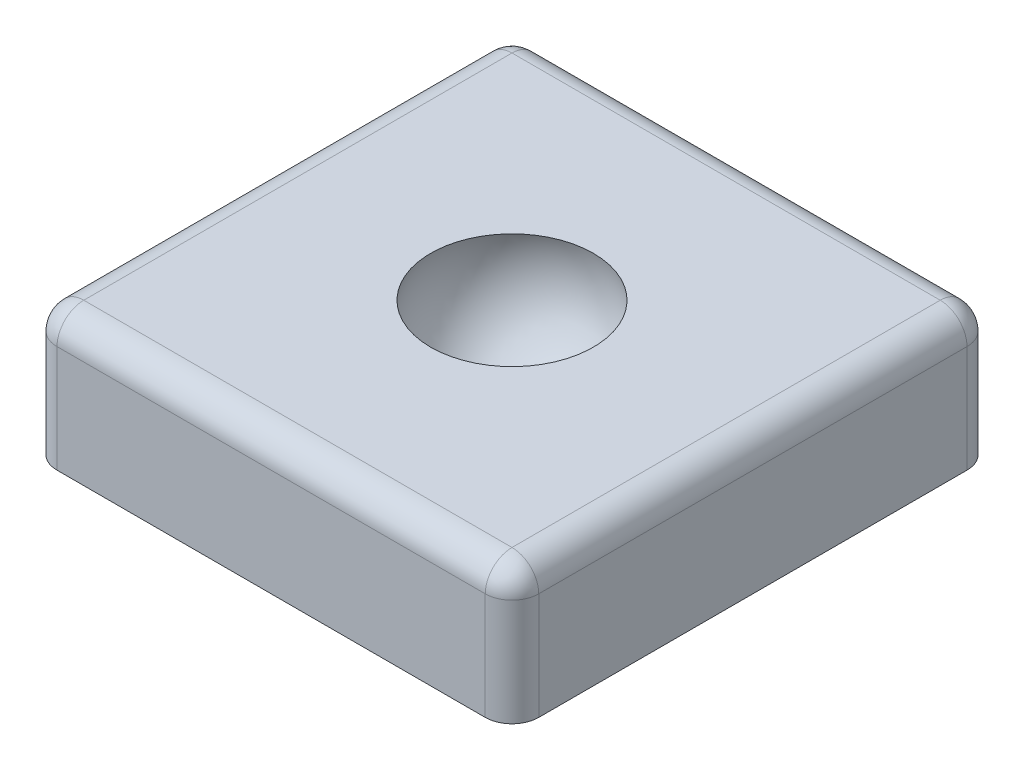
ISO-10303-21;
HEADER;
FILE_DESCRIPTION(('STEP AP214'),'2;1');
FILE_NAME('part.step','',(''),(''),'','','');
FILE_SCHEMA(('AUTOMOTIVE_DESIGN { 1 0 10303 214 1 1 1 1 }'));
ENDSEC;
DATA;
#1=APPLICATION_CONTEXT('core data for automotive mechanical design processes');
#2=APPLICATION_PROTOCOL_DEFINITION('international standard','automotive_design',2000,#1);
#3=PRODUCT_CONTEXT('',#1,'mechanical');
#4=PRODUCT('Part','Part','',(#3));
#5=PRODUCT_RELATED_PRODUCT_CATEGORY('part','',(#4));
#6=PRODUCT_DEFINITION_FORMATION('','',#4);
#7=PRODUCT_DEFINITION_CONTEXT('part definition',#1,'design');
#8=PRODUCT_DEFINITION('design','',#6,#7);
#9=PRODUCT_DEFINITION_SHAPE('','',#8);
#10=(LENGTH_UNIT() NAMED_UNIT(*) SI_UNIT(.MILLI.,.METRE.));
#11=(NAMED_UNIT(*) PLANE_ANGLE_UNIT() SI_UNIT($,.RADIAN.));
#12=(NAMED_UNIT(*) SI_UNIT($,.STERADIAN.) SOLID_ANGLE_UNIT());
#13=UNCERTAINTY_MEASURE_WITH_UNIT(LENGTH_MEASURE(1.E-05),#10,'distance_accuracy_value','');
#14=(GEOMETRIC_REPRESENTATION_CONTEXT(3) GLOBAL_UNCERTAINTY_ASSIGNED_CONTEXT((#13)) GLOBAL_UNIT_ASSIGNED_CONTEXT((#10,
#11,#12)) REPRESENTATION_CONTEXT('',''));
#15=CARTESIAN_POINT('',(0.,0.,0.));
#16=DIRECTION('',(0.,0.,1.));
#17=DIRECTION('',(1.,0.,0.));
#18=AXIS2_PLACEMENT_3D('',#15,#16,#17);
#19=CARTESIAN_POINT('',(18.,10.,18.));
#20=DIRECTION('',(-1.,0.,0.));
#21=DIRECTION('',(0.,0.,1.));
#22=AXIS2_PLACEMENT_3D('',#19,#20,#21);
#23=PLANE('',#22);
#24=DIRECTION('',(0.,0.,-1.));
#25=VECTOR('',#24,1.);
#26=CARTESIAN_POINT('',(18.,0.,18.));
#27=LINE('',#26,#25);
#28=CARTESIAN_POINT('',(18.,0.,16.));
#29=VERTEX_POINT('',#28);
#30=CARTESIAN_POINT('',(18.,0.,-16.));
#31=VERTEX_POINT('',#30);
#32=EDGE_CURVE('E240',#29,#31,#27,.T.);
#33=ORIENTED_EDGE('',*,*,#32,.T.);
#34=DIRECTION('',(0.,-1.,0.));
#35=VECTOR('',#34,1.);
#36=CARTESIAN_POINT('',(18.,10.,-16.));
#37=LINE('',#36,#35);
#38=CARTESIAN_POINT('',(18.,8.,-16.));
#39=VERTEX_POINT('',#38);
#40=EDGE_CURVE('E177',#31,#39,#37,.F.);
#41=ORIENTED_EDGE('',*,*,#40,.T.);
#42=DIRECTION('',(0.,0.,-1.));
#43=VECTOR('',#42,1.);
#44=CARTESIAN_POINT('',(18.,8.,18.));
#45=LINE('',#44,#43);
#46=CARTESIAN_POINT('',(18.,8.,16.));
#47=VERTEX_POINT('',#46);
#48=EDGE_CURVE('E174',#39,#47,#45,.F.);
#49=ORIENTED_EDGE('',*,*,#48,.T.);
#50=DIRECTION('',(0.,-1.,0.));
#51=VECTOR('',#50,1.);
#52=CARTESIAN_POINT('',(18.,10.,16.));
#53=LINE('',#52,#51);
#54=EDGE_CURVE('E171',#47,#29,#53,.T.);
#55=ORIENTED_EDGE('',*,*,#54,.T.);
#56=EDGE_LOOP('',(#33,#41,#49,#55));
#57=FACE_BOUND('',#56,.T.);
#58=ADVANCED_FACE('F39',(#57),#23,.F.);
#59=CARTESIAN_POINT('',(-18.,10.,-18.));
#60=DIRECTION('',(0.,0.,1.));
#61=DIRECTION('',(1.,0.,0.));
#62=AXIS2_PLACEMENT_3D('',#59,#60,#61);
#63=PLANE('',#62);
#64=DIRECTION('',(-1.,0.,0.));
#65=VECTOR('',#64,1.);
#66=CARTESIAN_POINT('',(-18.,0.,-18.));
#67=LINE('',#66,#65);
#68=CARTESIAN_POINT('',(16.,0.,-18.));
#69=VERTEX_POINT('',#68);
#70=CARTESIAN_POINT('',(-16.,0.,-18.));
#71=VERTEX_POINT('',#70);
#72=EDGE_CURVE('E246',#69,#71,#67,.T.);
#73=ORIENTED_EDGE('',*,*,#72,.T.);
#74=DIRECTION('',(0.,-1.,0.));
#75=VECTOR('',#74,1.);
#76=CARTESIAN_POINT('',(-16.,10.,-18.));
#77=LINE('',#76,#75);
#78=CARTESIAN_POINT('',(-16.,8.,-18.));
#79=VERTEX_POINT('',#78);
#80=EDGE_CURVE('E168',#71,#79,#77,.F.);
#81=ORIENTED_EDGE('',*,*,#80,.T.);
#82=DIRECTION('',(-1.,0.,0.));
#83=VECTOR('',#82,1.);
#84=CARTESIAN_POINT('',(-18.,8.,-18.));
#85=LINE('',#84,#83);
#86=CARTESIAN_POINT('',(16.,8.,-18.));
#87=VERTEX_POINT('',#86);
#88=EDGE_CURVE('E125',#79,#87,#85,.F.);
#89=ORIENTED_EDGE('',*,*,#88,.T.);
#90=DIRECTION('',(0.,-1.,0.));
#91=VECTOR('',#90,1.);
#92=CARTESIAN_POINT('',(16.,10.,-18.));
#93=LINE('',#92,#91);
#94=EDGE_CURVE('E158',#87,#69,#93,.T.);
#95=ORIENTED_EDGE('',*,*,#94,.T.);
#96=EDGE_LOOP('',(#73,#81,#89,#95));
#97=FACE_BOUND('',#96,.T.);
#98=ADVANCED_FACE('F271',(#97),#63,.F.);
#99=CARTESIAN_POINT('',(-18.,10.,18.));
#100=DIRECTION('',(1.,0.,0.));
#101=DIRECTION('',(0.,0.,-1.));
#102=AXIS2_PLACEMENT_3D('',#99,#100,#101);
#103=PLANE('',#102);
#104=DIRECTION('',(0.,0.,1.));
#105=VECTOR('',#104,1.);
#106=CARTESIAN_POINT('',(-18.,8.,18.));
#107=LINE('',#106,#105);
#108=CARTESIAN_POINT('',(-18.,8.,16.));
#109=VERTEX_POINT('',#108);
#110=CARTESIAN_POINT('',(-18.,8.,-16.));
#111=VERTEX_POINT('',#110);
#112=EDGE_CURVE('E57',#109,#111,#107,.F.);
#113=ORIENTED_EDGE('',*,*,#112,.T.);
#114=DIRECTION('',(0.,-1.,0.));
#115=VECTOR('',#114,1.);
#116=CARTESIAN_POINT('',(-18.,10.,-16.));
#117=LINE('',#116,#115);
#118=CARTESIAN_POINT('',(-18.,0.,-16.));
#119=VERTEX_POINT('',#118);
#120=EDGE_CURVE('E193',#111,#119,#117,.T.);
#121=ORIENTED_EDGE('',*,*,#120,.T.);
#122=DIRECTION('',(0.,0.,1.));
#123=VECTOR('',#122,1.);
#124=CARTESIAN_POINT('',(-18.,0.,18.));
#125=LINE('',#124,#123);
#126=CARTESIAN_POINT('',(-18.,0.,16.));
#127=VERTEX_POINT('',#126);
#128=EDGE_CURVE('E278',#119,#127,#125,.T.);
#129=ORIENTED_EDGE('',*,*,#128,.T.);
#130=DIRECTION('',(0.,-1.,0.));
#131=VECTOR('',#130,1.);
#132=CARTESIAN_POINT('',(-18.,10.,16.));
#133=LINE('',#132,#131);
#134=EDGE_CURVE('E62',#127,#109,#133,.F.);
#135=ORIENTED_EDGE('',*,*,#134,.T.);
#136=EDGE_LOOP('',(#113,#121,#129,#135));
#137=FACE_BOUND('',#136,.T.);
#138=ADVANCED_FACE('F277',(#137),#103,.F.);
#139=CARTESIAN_POINT('',(-18.,10.,18.));
#140=DIRECTION('',(0.,0.,-1.));
#141=DIRECTION('',(-1.,0.,0.));
#142=AXIS2_PLACEMENT_3D('',#139,#140,#141);
#143=PLANE('',#142);
#144=DIRECTION('',(1.,0.,0.));
#145=VECTOR('',#144,1.);
#146=CARTESIAN_POINT('',(-18.,8.,18.));
#147=LINE('',#146,#145);
#148=CARTESIAN_POINT('',(16.,8.,18.));
#149=VERTEX_POINT('',#148);
#150=CARTESIAN_POINT('',(-16.,8.,18.));
#151=VERTEX_POINT('',#150);
#152=EDGE_CURVE('E183',#149,#151,#147,.F.);
#153=ORIENTED_EDGE('',*,*,#152,.T.);
#154=DIRECTION('',(0.,-1.,0.));
#155=VECTOR('',#154,1.);
#156=CARTESIAN_POINT('',(-16.,10.,18.));
#157=LINE('',#156,#155);
#158=CARTESIAN_POINT('',(-16.,0.,18.));
#159=VERTEX_POINT('',#158);
#160=EDGE_CURVE('E186',#151,#159,#157,.T.);
#161=ORIENTED_EDGE('',*,*,#160,.T.);
#162=DIRECTION('',(1.,0.,0.));
#163=VECTOR('',#162,1.);
#164=CARTESIAN_POINT('',(-18.,0.,18.));
#165=LINE('',#164,#163);
#166=CARTESIAN_POINT('',(16.,0.,18.));
#167=VERTEX_POINT('',#166);
#168=EDGE_CURVE('E150',#159,#167,#165,.T.);
#169=ORIENTED_EDGE('',*,*,#168,.T.);
#170=DIRECTION('',(0.,-1.,0.));
#171=VECTOR('',#170,1.);
#172=CARTESIAN_POINT('',(16.,10.,18.));
#173=LINE('',#172,#171);
#174=EDGE_CURVE('E180',#167,#149,#173,.F.);
#175=ORIENTED_EDGE('',*,*,#174,.T.);
#176=EDGE_LOOP('',(#153,#161,#169,#175));
#177=FACE_BOUND('',#176,.T.);
#178=ADVANCED_FACE('F290',(#177),#143,.F.);
#179=CARTESIAN_POINT('',(0.,10.,0.));
#180=DIRECTION('',(0.,-1.,0.));
#181=DIRECTION('',(0.,0.,-1.));
#182=AXIS2_PLACEMENT_3D('',#179,#180,#181);
#183=PLANE('',#182);
#184=DIRECTION('',(0.,0.,-1.));
#185=VECTOR('',#184,1.);
#186=CARTESIAN_POINT('',(16.,10.,0.));
#187=LINE('',#186,#185);
#188=CARTESIAN_POINT('',(16.,10.,16.));
#189=VERTEX_POINT('',#188);
#190=CARTESIAN_POINT('',(16.,10.,-16.));
#191=VERTEX_POINT('',#190);
#192=EDGE_CURVE('E155',#189,#191,#187,.T.);
#193=ORIENTED_EDGE('',*,*,#192,.T.);
#194=DIRECTION('',(-1.,0.,0.));
#195=VECTOR('',#194,1.);
#196=CARTESIAN_POINT('',(0.,10.,-16.));
#197=LINE('',#196,#195);
#198=CARTESIAN_POINT('',(-16.,10.,-16.));
#199=VERTEX_POINT('',#198);
#200=EDGE_CURVE('E123',#191,#199,#197,.T.);
#201=ORIENTED_EDGE('',*,*,#200,.T.);
#202=DIRECTION('',(0.,0.,1.));
#203=VECTOR('',#202,1.);
#204=CARTESIAN_POINT('',(-16.,10.,0.));
#205=LINE('',#204,#203);
#206=CARTESIAN_POINT('',(-16.,10.,16.));
#207=VERTEX_POINT('',#206);
#208=EDGE_CURVE('E142',#199,#207,#205,.T.);
#209=ORIENTED_EDGE('',*,*,#208,.T.);
#210=DIRECTION('',(1.,0.,0.));
#211=VECTOR('',#210,1.);
#212=CARTESIAN_POINT('',(0.,10.,16.));
#213=LINE('',#212,#211);
#214=EDGE_CURVE('E149',#207,#189,#213,.T.);
#215=ORIENTED_EDGE('',*,*,#214,.T.);
#216=EDGE_LOOP('',(#193,#201,#209,#215));
#217=FACE_BOUND('',#216,.T.);
#218=CARTESIAN_POINT('',(0.,10.,0.));
#219=DIRECTION('',(0.,-1.,0.));
#220=DIRECTION('',(0.,0.,-1.));
#221=AXIS2_PLACEMENT_3D('',#218,#219,#220);
#222=CIRCLE('',#221,6.07947366142827);
#223=CARTESIAN_POINT('',(0.,10.,-6.07947366142827));
#224=VERTEX_POINT('',#223);
#225=EDGE_CURVE('E236',#224,#224,#222,.F.);
#226=ORIENTED_EDGE('',*,*,#225,.F.);
#227=EDGE_LOOP('',(#226));
#228=FACE_BOUND('',#227,.T.);
#229=ADVANCED_FACE('F152',(#217,#228),#183,.F.);
#230=CARTESIAN_POINT('',(0.,0.,0.));
#231=DIRECTION('',(0.,-1.,0.));
#232=DIRECTION('',(0.,0.,-1.));
#233=AXIS2_PLACEMENT_3D('',#230,#231,#232);
#234=PLANE('',#233);
#235=ORIENTED_EDGE('',*,*,#128,.F.);
#236=CARTESIAN_POINT('',(-16.,0.,-16.));
#237=DIRECTION('',(0.,-1.,0.));
#238=DIRECTION('',(0.,0.,-1.));
#239=AXIS2_PLACEMENT_3D('',#236,#237,#238);
#240=CIRCLE('',#239,2.);
#241=EDGE_CURVE('E11',#119,#71,#240,.T.);
#242=ORIENTED_EDGE('',*,*,#241,.T.);
#243=ORIENTED_EDGE('',*,*,#72,.F.);
#244=CARTESIAN_POINT('',(16.,0.,-16.));
#245=DIRECTION('',(0.,-1.,0.));
#246=DIRECTION('',(0.,0.,-1.));
#247=AXIS2_PLACEMENT_3D('',#244,#245,#246);
#248=CIRCLE('',#247,2.);
#249=EDGE_CURVE('E199',#69,#31,#248,.T.);
#250=ORIENTED_EDGE('',*,*,#249,.T.);
#251=ORIENTED_EDGE('',*,*,#32,.F.);
#252=CARTESIAN_POINT('',(16.,0.,16.));
#253=DIRECTION('',(0.,-1.,0.));
#254=DIRECTION('',(0.,0.,-1.));
#255=AXIS2_PLACEMENT_3D('',#252,#253,#254);
#256=CIRCLE('',#255,2.);
#257=EDGE_CURVE('E196',#29,#167,#256,.T.);
#258=ORIENTED_EDGE('',*,*,#257,.T.);
#259=ORIENTED_EDGE('',*,*,#168,.F.);
#260=CARTESIAN_POINT('',(-16.,0.,16.));
#261=DIRECTION('',(0.,-1.,0.));
#262=DIRECTION('',(0.,0.,-1.));
#263=AXIS2_PLACEMENT_3D('',#260,#261,#262);
#264=CIRCLE('',#263,2.);
#265=EDGE_CURVE('E49',#159,#127,#264,.T.);
#266=ORIENTED_EDGE('',*,*,#265,.T.);
#267=EDGE_LOOP('',(#235,#242,#243,#250,#251,#258,#259,#266));
#268=FACE_BOUND('',#267,.T.);
#269=ADVANCED_FACE('F280',(#268),#234,.T.);
#270=CARTESIAN_POINT('',(0.,8.,0.));
#271=DIRECTION('',(-1.,0.,0.));
#272=DIRECTION('',(0.,0.,-1.));
#273=AXIS2_PLACEMENT_3D('',#270,#271,#272);
#274=SPHERICAL_SURFACE('',#273,6.4);
#275=CARTESIAN_POINT('',(0.,8.,0.));
#276=DIRECTION('',(0.,-1.,0.));
#277=DIRECTION('',(0.,0.,-1.));
#278=AXIS2_PLACEMENT_3D('',#275,#276,#277);
#279=SPHERICAL_SURFACE('',#278,6.4);
#280=ORIENTED_EDGE('',*,*,#225,.T.);
#281=EDGE_LOOP('',(#280));
#282=FACE_BOUND('',#281,.T.);
#283=ADVANCED_FACE('F332',(#282),#279,.F.);
#284=CARTESIAN_POINT('',(16.,10.,16.));
#285=DIRECTION('',(0.,-1.,0.));
#286=DIRECTION('',(0.,0.,-1.));
#287=AXIS2_PLACEMENT_3D('',#284,#285,#286);
#288=CYLINDRICAL_SURFACE('',#287,2.);
#289=ORIENTED_EDGE('',*,*,#257,.F.);
#290=ORIENTED_EDGE('',*,*,#54,.F.);
#291=CARTESIAN_POINT('',(16.,8.,16.));
#292=DIRECTION('',(0.,1.,0.));
#293=DIRECTION('',(0.,0.,1.));
#294=AXIS2_PLACEMENT_3D('',#291,#292,#293);
#295=CIRCLE('',#294,2.);
#296=EDGE_CURVE('E43',#149,#47,#295,.T.);
#297=ORIENTED_EDGE('',*,*,#296,.F.);
#298=ORIENTED_EDGE('',*,*,#174,.F.);
#299=EDGE_LOOP('',(#289,#290,#297,#298));
#300=FACE_BOUND('',#299,.T.);
#301=ADVANCED_FACE('F41',(#300),#288,.T.);
#302=CARTESIAN_POINT('',(0.,8.,16.));
#303=DIRECTION('',(1.,0.,0.));
#304=DIRECTION('',(0.,0.,-1.));
#305=AXIS2_PLACEMENT_3D('',#302,#303,#304);
#306=CYLINDRICAL_SURFACE('',#305,2.);
#307=CARTESIAN_POINT('',(-16.,8.,16.));
#308=DIRECTION('',(-1.,0.,0.));
#309=DIRECTION('',(0.,0.,1.));
#310=AXIS2_PLACEMENT_3D('',#307,#308,#309);
#311=CIRCLE('',#310,2.);
#312=EDGE_CURVE('E225',#151,#207,#311,.T.);
#313=ORIENTED_EDGE('',*,*,#312,.F.);
#314=ORIENTED_EDGE('',*,*,#152,.F.);
#315=CARTESIAN_POINT('',(16.,8.,16.));
#316=DIRECTION('',(1.,0.,0.));
#317=DIRECTION('',(0.,0.,-1.));
#318=AXIS2_PLACEMENT_3D('',#315,#316,#317);
#319=CIRCLE('',#318,2.);
#320=EDGE_CURVE('E228',#189,#149,#319,.T.);
#321=ORIENTED_EDGE('',*,*,#320,.F.);
#322=ORIENTED_EDGE('',*,*,#214,.F.);
#323=EDGE_LOOP('',(#313,#314,#321,#322));
#324=FACE_BOUND('',#323,.T.);
#325=ADVANCED_FACE('F254',(#324),#306,.T.);
#326=CARTESIAN_POINT('',(-16.,10.,16.));
#327=DIRECTION('',(0.,-1.,0.));
#328=DIRECTION('',(0.,0.,-1.));
#329=AXIS2_PLACEMENT_3D('',#326,#327,#328);
#330=CYLINDRICAL_SURFACE('',#329,2.);
#331=ORIENTED_EDGE('',*,*,#265,.F.);
#332=ORIENTED_EDGE('',*,*,#160,.F.);
#333=CARTESIAN_POINT('',(-16.,8.,16.));
#334=DIRECTION('',(0.,1.,0.));
#335=DIRECTION('',(0.,0.,1.));
#336=AXIS2_PLACEMENT_3D('',#333,#334,#335);
#337=CIRCLE('',#336,2.);
#338=EDGE_CURVE('E221',#109,#151,#337,.T.);
#339=ORIENTED_EDGE('',*,*,#338,.F.);
#340=ORIENTED_EDGE('',*,*,#134,.F.);
#341=EDGE_LOOP('',(#331,#332,#339,#340));
#342=FACE_BOUND('',#341,.T.);
#343=ADVANCED_FACE('F325',(#342),#330,.T.);
#344=CARTESIAN_POINT('',(16.,8.,16.));
#345=DIRECTION('',(0.,0.,1.));
#346=DIRECTION('',(1.,0.,0.));
#347=AXIS2_PLACEMENT_3D('',#344,#345,#346);
#348=SPHERICAL_SURFACE('',#347,2.);
#349=ORIENTED_EDGE('',*,*,#320,.T.);
#350=ORIENTED_EDGE('',*,*,#296,.T.);
#351=CARTESIAN_POINT('',(16.,8.,16.));
#352=DIRECTION('',(0.,0.,1.));
#353=DIRECTION('',(1.,0.,0.));
#354=AXIS2_PLACEMENT_3D('',#351,#352,#353);
#355=CIRCLE('',#354,2.);
#356=EDGE_CURVE('E217',#189,#47,#355,.F.);
#357=ORIENTED_EDGE('',*,*,#356,.F.);
#358=EDGE_LOOP('',(#349,#350,#357));
#359=FACE_BOUND('',#358,.T.);
#360=ADVANCED_FACE('F255',(#359),#348,.T.);
#361=CARTESIAN_POINT('',(-16.,8.,16.));
#362=DIRECTION('',(0.,0.,1.));
#363=DIRECTION('',(1.,0.,0.));
#364=AXIS2_PLACEMENT_3D('',#361,#362,#363);
#365=SPHERICAL_SURFACE('',#364,2.);
#366=ORIENTED_EDGE('',*,*,#338,.T.);
#367=ORIENTED_EDGE('',*,*,#312,.T.);
#368=CARTESIAN_POINT('',(-16.,8.,16.));
#369=DIRECTION('',(0.,0.,1.));
#370=DIRECTION('',(1.,0.,0.));
#371=AXIS2_PLACEMENT_3D('',#368,#369,#370);
#372=CIRCLE('',#371,2.);
#373=EDGE_CURVE('E145',#109,#207,#372,.F.);
#374=ORIENTED_EDGE('',*,*,#373,.F.);
#375=EDGE_LOOP('',(#366,#367,#374));
#376=FACE_BOUND('',#375,.T.);
#377=ADVANCED_FACE('F319',(#376),#365,.T.);
#378=CARTESIAN_POINT('',(16.,10.,-16.));
#379=DIRECTION('',(0.,-1.,0.));
#380=DIRECTION('',(0.,0.,-1.));
#381=AXIS2_PLACEMENT_3D('',#378,#379,#380);
#382=CYLINDRICAL_SURFACE('',#381,2.);
#383=ORIENTED_EDGE('',*,*,#249,.F.);
#384=ORIENTED_EDGE('',*,*,#94,.F.);
#385=CARTESIAN_POINT('',(16.,8.,-16.));
#386=DIRECTION('',(0.,1.,0.));
#387=DIRECTION('',(0.,0.,1.));
#388=AXIS2_PLACEMENT_3D('',#385,#386,#387);
#389=CIRCLE('',#388,2.);
#390=EDGE_CURVE('E211',#39,#87,#389,.T.);
#391=ORIENTED_EDGE('',*,*,#390,.F.);
#392=ORIENTED_EDGE('',*,*,#40,.F.);
#393=EDGE_LOOP('',(#383,#384,#391,#392));
#394=FACE_BOUND('',#393,.T.);
#395=ADVANCED_FACE('F267',(#394),#382,.T.);
#396=CARTESIAN_POINT('',(16.,8.,0.));
#397=DIRECTION('',(0.,0.,-1.));
#398=DIRECTION('',(-1.,0.,0.));
#399=AXIS2_PLACEMENT_3D('',#396,#397,#398);
#400=CYLINDRICAL_SURFACE('',#399,2.);
#401=ORIENTED_EDGE('',*,*,#356,.T.);
#402=ORIENTED_EDGE('',*,*,#48,.F.);
#403=CARTESIAN_POINT('',(16.,8.,-16.));
#404=DIRECTION('',(0.,0.,-1.));
#405=DIRECTION('',(-1.,0.,0.));
#406=AXIS2_PLACEMENT_3D('',#403,#404,#405);
#407=CIRCLE('',#406,2.);
#408=EDGE_CURVE('E139',#191,#39,#407,.T.);
#409=ORIENTED_EDGE('',*,*,#408,.F.);
#410=ORIENTED_EDGE('',*,*,#192,.F.);
#411=EDGE_LOOP('',(#401,#402,#409,#410));
#412=FACE_BOUND('',#411,.T.);
#413=ADVANCED_FACE('F258',(#412),#400,.T.);
#414=CARTESIAN_POINT('',(-16.,8.,0.));
#415=DIRECTION('',(0.,0.,1.));
#416=DIRECTION('',(1.,0.,0.));
#417=AXIS2_PLACEMENT_3D('',#414,#415,#416);
#418=CYLINDRICAL_SURFACE('',#417,2.);
#419=ORIENTED_EDGE('',*,*,#373,.T.);
#420=ORIENTED_EDGE('',*,*,#208,.F.);
#421=CARTESIAN_POINT('',(-16.,8.,-16.));
#422=DIRECTION('',(0.,0.,-1.));
#423=DIRECTION('',(0.,1.,0.));
#424=AXIS2_PLACEMENT_3D('',#421,#422,#423);
#425=CIRCLE('',#424,2.);
#426=EDGE_CURVE('E132',#111,#199,#425,.T.);
#427=ORIENTED_EDGE('',*,*,#426,.F.);
#428=ORIENTED_EDGE('',*,*,#112,.F.);
#429=EDGE_LOOP('',(#419,#420,#427,#428));
#430=FACE_BOUND('',#429,.T.);
#431=ADVANCED_FACE('F143',(#430),#418,.T.);
#432=CARTESIAN_POINT('',(-16.,10.,-16.));
#433=DIRECTION('',(0.,-1.,0.));
#434=DIRECTION('',(0.,0.,-1.));
#435=AXIS2_PLACEMENT_3D('',#432,#433,#434);
#436=CYLINDRICAL_SURFACE('',#435,2.);
#437=ORIENTED_EDGE('',*,*,#241,.F.);
#438=ORIENTED_EDGE('',*,*,#120,.F.);
#439=CARTESIAN_POINT('',(-16.,8.,-16.));
#440=DIRECTION('',(0.,1.,0.));
#441=DIRECTION('',(0.,0.,1.));
#442=AXIS2_PLACEMENT_3D('',#439,#440,#441);
#443=CIRCLE('',#442,2.);
#444=EDGE_CURVE('E136',#79,#111,#443,.T.);
#445=ORIENTED_EDGE('',*,*,#444,.F.);
#446=ORIENTED_EDGE('',*,*,#80,.F.);
#447=EDGE_LOOP('',(#437,#438,#445,#446));
#448=FACE_BOUND('',#447,.T.);
#449=ADVANCED_FACE('F275',(#448),#436,.T.);
#450=CARTESIAN_POINT('',(16.,8.,-16.));
#451=DIRECTION('',(1.,0.,0.));
#452=DIRECTION('',(0.,0.,-1.));
#453=AXIS2_PLACEMENT_3D('',#450,#451,#452);
#454=SPHERICAL_SURFACE('',#453,2.);
#455=ORIENTED_EDGE('',*,*,#408,.T.);
#456=ORIENTED_EDGE('',*,*,#390,.T.);
#457=CARTESIAN_POINT('',(16.,8.,-16.));
#458=DIRECTION('',(1.,0.,0.));
#459=DIRECTION('',(0.,1.,0.));
#460=AXIS2_PLACEMENT_3D('',#457,#458,#459);
#461=CIRCLE('',#460,2.);
#462=EDGE_CURVE('E129',#191,#87,#461,.F.);
#463=ORIENTED_EDGE('',*,*,#462,.F.);
#464=EDGE_LOOP('',(#455,#456,#463));
#465=FACE_BOUND('',#464,.T.);
#466=ADVANCED_FACE('F262',(#465),#454,.T.);
#467=CARTESIAN_POINT('',(-16.,8.,-16.));
#468=DIRECTION('',(-1.,0.,0.));
#469=DIRECTION('',(0.,0.,1.));
#470=AXIS2_PLACEMENT_3D('',#467,#468,#469);
#471=SPHERICAL_SURFACE('',#470,2.);
#472=ORIENTED_EDGE('',*,*,#444,.T.);
#473=ORIENTED_EDGE('',*,*,#426,.T.);
#474=CARTESIAN_POINT('',(-16.,8.,-16.));
#475=DIRECTION('',(-1.,0.,0.));
#476=DIRECTION('',(0.,0.,1.));
#477=AXIS2_PLACEMENT_3D('',#474,#475,#476);
#478=CIRCLE('',#477,2.);
#479=EDGE_CURVE('E119',#79,#199,#478,.F.);
#480=ORIENTED_EDGE('',*,*,#479,.F.);
#481=EDGE_LOOP('',(#472,#473,#480));
#482=FACE_BOUND('',#481,.T.);
#483=ADVANCED_FACE('F134',(#482),#471,.T.);
#484=CARTESIAN_POINT('',(0.,8.,-16.));
#485=DIRECTION('',(-1.,0.,0.));
#486=DIRECTION('',(0.,0.,1.));
#487=AXIS2_PLACEMENT_3D('',#484,#485,#486);
#488=CYLINDRICAL_SURFACE('',#487,2.);
#489=ORIENTED_EDGE('',*,*,#462,.T.);
#490=ORIENTED_EDGE('',*,*,#88,.F.);
#491=ORIENTED_EDGE('',*,*,#479,.T.);
#492=ORIENTED_EDGE('',*,*,#200,.F.);
#493=EDGE_LOOP('',(#489,#490,#491,#492));
#494=FACE_BOUND('',#493,.T.);
#495=ADVANCED_FACE('F121',(#494),#488,.T.);
#496=CLOSED_SHELL('',(#58,#98,#138,#178,#229,#269,#283,#301,#325,#343,#360,#377,#395,#413,#431,
#449,#466,#483,#495));
#497=MANIFOLD_SOLID_BREP('B2',#496);
#498=ADVANCED_BREP_SHAPE_REPRESENTATION('',(#18,#497),#14);
#499=SHAPE_DEFINITION_REPRESENTATION(#9,#498);
ENDSEC;
END-ISO-10303-21;
